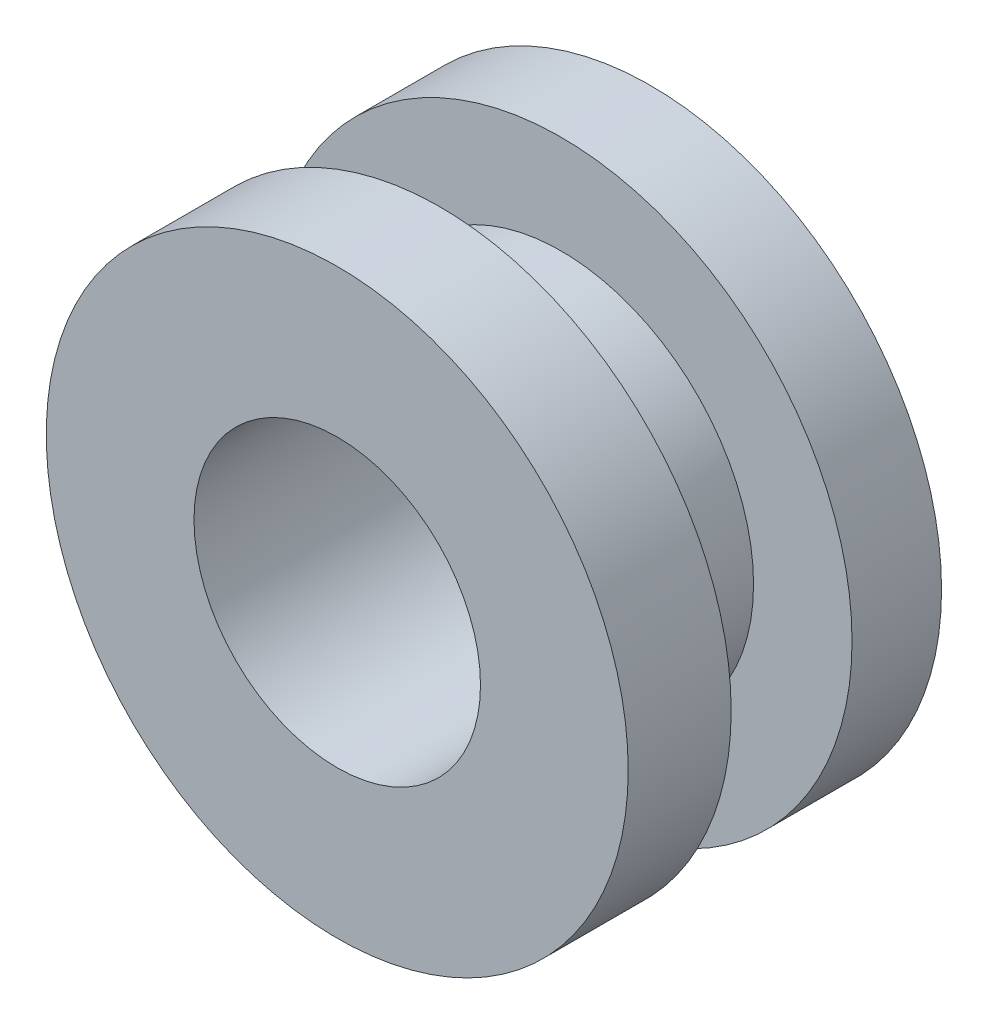
ISO-10303-21;
HEADER;
FILE_DESCRIPTION(('STEP AP214'),'2;1');
FILE_NAME('part.step','',(''),(''),'','','');
FILE_SCHEMA(('AUTOMOTIVE_DESIGN { 1 0 10303 214 1 1 1 1 }'));
ENDSEC;
DATA;
#1=APPLICATION_CONTEXT('core data for automotive mechanical design processes');
#2=APPLICATION_PROTOCOL_DEFINITION('international standard','automotive_design',2000,#1);
#3=PRODUCT_CONTEXT('',#1,'mechanical');
#4=PRODUCT('Part','Part','',(#3));
#5=PRODUCT_RELATED_PRODUCT_CATEGORY('part','',(#4));
#6=PRODUCT_DEFINITION_FORMATION('','',#4);
#7=PRODUCT_DEFINITION_CONTEXT('part definition',#1,'design');
#8=PRODUCT_DEFINITION('design','',#6,#7);
#9=PRODUCT_DEFINITION_SHAPE('','',#8);
#10=(LENGTH_UNIT() NAMED_UNIT(*) SI_UNIT(.MILLI.,.METRE.));
#11=(NAMED_UNIT(*) PLANE_ANGLE_UNIT() SI_UNIT($,.RADIAN.));
#12=(NAMED_UNIT(*) SI_UNIT($,.STERADIAN.) SOLID_ANGLE_UNIT());
#13=UNCERTAINTY_MEASURE_WITH_UNIT(LENGTH_MEASURE(1.E-05),#10,'distance_accuracy_value','');
#14=(GEOMETRIC_REPRESENTATION_CONTEXT(3) GLOBAL_UNCERTAINTY_ASSIGNED_CONTEXT((#13)) GLOBAL_UNIT_ASSIGNED_CONTEXT((#10,
#11,#12)) REPRESENTATION_CONTEXT('',''));
#15=CARTESIAN_POINT('',(0.,0.,0.));
#16=DIRECTION('',(0.,0.,1.));
#17=DIRECTION('',(1.,0.,0.));
#18=AXIS2_PLACEMENT_3D('',#15,#16,#17);
#19=CARTESIAN_POINT('',(0.,0.,7.));
#20=DIRECTION('',(0.,0.,1.));
#21=DIRECTION('',(1.,0.,0.));
#22=AXIS2_PLACEMENT_3D('',#19,#20,#21);
#23=CYLINDRICAL_SURFACE('',#22,6.5);
#24=CARTESIAN_POINT('',(0.,0.,0.));
#25=DIRECTION('',(0.,0.,1.));
#26=DIRECTION('',(1.,0.,0.));
#27=AXIS2_PLACEMENT_3D('',#24,#25,#26);
#28=CIRCLE('',#27,6.5);
#29=CARTESIAN_POINT('',(6.5,0.,0.));
#30=VERTEX_POINT('',#29);
#31=EDGE_CURVE('E53',#30,#30,#28,.T.);
#32=ORIENTED_EDGE('',*,*,#31,.T.);
#33=EDGE_LOOP('',(#32));
#34=FACE_BOUND('',#33,.T.);
#35=CARTESIAN_POINT('',(0.,0.,2.));
#36=DIRECTION('',(0.,0.,1.));
#37=DIRECTION('',(1.,0.,0.));
#38=AXIS2_PLACEMENT_3D('',#35,#36,#37);
#39=CIRCLE('',#38,6.5);
#40=CARTESIAN_POINT('',(6.5,0.,2.));
#41=VERTEX_POINT('',#40);
#42=EDGE_CURVE('E10',#41,#41,#39,.T.);
#43=ORIENTED_EDGE('',*,*,#42,.F.);
#44=EDGE_LOOP('',(#43));
#45=FACE_BOUND('',#44,.T.);
#46=ADVANCED_FACE('F31',(#34,#45),#23,.T.);
#47=CARTESIAN_POINT('',(0.,3.25,2.));
#48=DIRECTION('',(0.,0.,1.));
#49=DIRECTION('',(1.,0.,0.));
#50=AXIS2_PLACEMENT_3D('',#47,#48,#49);
#51=PLANE('',#50);
#52=ORIENTED_EDGE('',*,*,#42,.T.);
#53=EDGE_LOOP('',(#52));
#54=FACE_BOUND('',#53,.T.);
#55=CARTESIAN_POINT('',(0.,0.,2.));
#56=DIRECTION('',(0.,0.,1.));
#57=DIRECTION('',(1.,0.,0.));
#58=AXIS2_PLACEMENT_3D('',#55,#56,#57);
#59=CIRCLE('',#58,4.3);
#60=CARTESIAN_POINT('',(4.3,0.,2.));
#61=VERTEX_POINT('',#60);
#62=EDGE_CURVE('E37',#61,#61,#59,.T.);
#63=ORIENTED_EDGE('',*,*,#62,.F.);
#64=EDGE_LOOP('',(#63));
#65=FACE_BOUND('',#64,.T.);
#66=ADVANCED_FACE('F74',(#54,#65),#51,.T.);
#67=CARTESIAN_POINT('',(0.,0.,7.));
#68=DIRECTION('',(0.,0.,1.));
#69=DIRECTION('',(1.,0.,0.));
#70=AXIS2_PLACEMENT_3D('',#67,#68,#69);
#71=CYLINDRICAL_SURFACE('',#70,4.3);
#72=ORIENTED_EDGE('',*,*,#62,.T.);
#73=EDGE_LOOP('',(#72));
#74=FACE_BOUND('',#73,.T.);
#75=CARTESIAN_POINT('',(0.,0.,4.7));
#76=DIRECTION('',(0.,0.,1.));
#77=DIRECTION('',(1.,0.,0.));
#78=AXIS2_PLACEMENT_3D('',#75,#76,#77);
#79=CIRCLE('',#78,4.3);
#80=CARTESIAN_POINT('',(4.3,0.,4.7));
#81=VERTEX_POINT('',#80);
#82=EDGE_CURVE('E41',#81,#81,#79,.T.);
#83=ORIENTED_EDGE('',*,*,#82,.F.);
#84=EDGE_LOOP('',(#83));
#85=FACE_BOUND('',#84,.T.);
#86=ADVANCED_FACE('F78',(#74,#85),#71,.T.);
#87=CARTESIAN_POINT('',(0.,3.25,4.7));
#88=DIRECTION('',(0.,0.,-1.));
#89=DIRECTION('',(-1.,0.,0.));
#90=AXIS2_PLACEMENT_3D('',#87,#88,#89);
#91=PLANE('',#90);
#92=ORIENTED_EDGE('',*,*,#82,.T.);
#93=EDGE_LOOP('',(#92));
#94=FACE_BOUND('',#93,.T.);
#95=CARTESIAN_POINT('',(0.,0.,4.7));
#96=DIRECTION('',(0.,0.,1.));
#97=DIRECTION('',(1.,0.,0.));
#98=AXIS2_PLACEMENT_3D('',#95,#96,#97);
#99=CIRCLE('',#98,6.5);
#100=CARTESIAN_POINT('',(6.5,0.,4.7));
#101=VERTEX_POINT('',#100);
#102=EDGE_CURVE('E45',#101,#101,#99,.T.);
#103=ORIENTED_EDGE('',*,*,#102,.F.);
#104=EDGE_LOOP('',(#103));
#105=FACE_BOUND('',#104,.T.);
#106=ADVANCED_FACE('F82',(#94,#105),#91,.T.);
#107=CARTESIAN_POINT('',(0.,0.,7.));
#108=DIRECTION('',(0.,0.,1.));
#109=DIRECTION('',(1.,0.,0.));
#110=AXIS2_PLACEMENT_3D('',#107,#108,#109);
#111=CYLINDRICAL_SURFACE('',#110,6.5);
#112=ORIENTED_EDGE('',*,*,#102,.T.);
#113=EDGE_LOOP('',(#112));
#114=FACE_BOUND('',#113,.T.);
#115=CARTESIAN_POINT('',(0.,0.,7.));
#116=DIRECTION('',(0.,0.,1.));
#117=DIRECTION('',(1.,0.,0.));
#118=AXIS2_PLACEMENT_3D('',#115,#116,#117);
#119=CIRCLE('',#118,6.5);
#120=CARTESIAN_POINT('',(6.5,0.,7.));
#121=VERTEX_POINT('',#120);
#122=EDGE_CURVE('E50',#121,#121,#119,.T.);
#123=ORIENTED_EDGE('',*,*,#122,.F.);
#124=EDGE_LOOP('',(#123));
#125=FACE_BOUND('',#124,.T.);
#126=ADVANCED_FACE('F88',(#114,#125),#111,.T.);
#127=CARTESIAN_POINT('',(0.,3.25,7.));
#128=DIRECTION('',(0.,0.,-1.));
#129=DIRECTION('',(-1.,0.,0.));
#130=AXIS2_PLACEMENT_3D('',#127,#128,#129);
#131=PLANE('',#130);
#132=CARTESIAN_POINT('',(0.,0.,7.));
#133=DIRECTION('',(0.,0.,-1.));
#134=DIRECTION('',(-1.,0.,0.));
#135=AXIS2_PLACEMENT_3D('',#132,#133,#134);
#136=CIRCLE('',#135,3.2);
#137=CARTESIAN_POINT('',(-3.2,0.,7.));
#138=VERTEX_POINT('',#137);
#139=EDGE_CURVE('E56',#138,#138,#136,.T.);
#140=ORIENTED_EDGE('',*,*,#139,.T.);
#141=EDGE_LOOP('',(#140));
#142=FACE_BOUND('',#141,.T.);
#143=ORIENTED_EDGE('',*,*,#122,.T.);
#144=EDGE_LOOP('',(#143));
#145=FACE_BOUND('',#144,.T.);
#146=ADVANCED_FACE('F68',(#142,#145),#131,.F.);
#147=CARTESIAN_POINT('',(0.,3.25,0.));
#148=DIRECTION('',(0.,0.,1.));
#149=DIRECTION('',(1.,0.,0.));
#150=AXIS2_PLACEMENT_3D('',#147,#148,#149);
#151=PLANE('',#150);
#152=CARTESIAN_POINT('',(0.,0.,0.));
#153=DIRECTION('',(0.,0.,-1.));
#154=DIRECTION('',(-1.,0.,0.));
#155=AXIS2_PLACEMENT_3D('',#152,#153,#154);
#156=CIRCLE('',#155,3.19999999999999);
#157=CARTESIAN_POINT('',(-3.19999999999999,0.,0.));
#158=VERTEX_POINT('',#157);
#159=EDGE_CURVE('E59',#158,#158,#156,.T.);
#160=ORIENTED_EDGE('',*,*,#159,.F.);
#161=EDGE_LOOP('',(#160));
#162=FACE_BOUND('',#161,.T.);
#163=ORIENTED_EDGE('',*,*,#31,.F.);
#164=EDGE_LOOP('',(#163));
#165=FACE_BOUND('',#164,.T.);
#166=ADVANCED_FACE('F65',(#162,#165),#151,.F.);
#167=CARTESIAN_POINT('',(0.,0.,0.));
#168=DIRECTION('',(0.,0.,-1.));
#169=DIRECTION('',(-1.,0.,0.));
#170=AXIS2_PLACEMENT_3D('',#167,#168,#169);
#171=CYLINDRICAL_SURFACE('',#170,3.19999999999999);
#172=ORIENTED_EDGE('',*,*,#139,.F.);
#173=EDGE_LOOP('',(#172));
#174=FACE_BOUND('',#173,.T.);
#175=ORIENTED_EDGE('',*,*,#159,.T.);
#176=EDGE_LOOP('',(#175));
#177=FACE_BOUND('',#176,.T.);
#178=ADVANCED_FACE('F63',(#174,#177),#171,.F.);
#179=CLOSED_SHELL('',(#46,#66,#86,#106,#126,#146,#166,#178));
#180=MANIFOLD_SOLID_BREP('B2',#179);
#181=ADVANCED_BREP_SHAPE_REPRESENTATION('',(#18,#180),#14);
#182=SHAPE_DEFINITION_REPRESENTATION(#9,#181);
ENDSEC;
END-ISO-10303-21;
